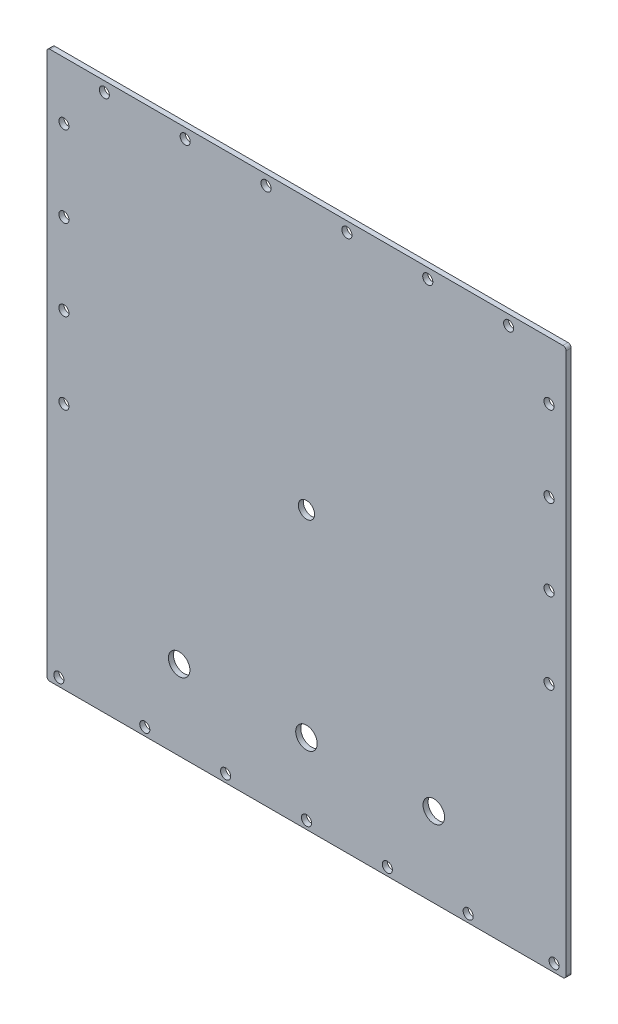
ISO-10303-21;
HEADER;
FILE_DESCRIPTION(('STEP AP214'),'2;1');
FILE_NAME('part.step','',(''),(''),'','','');
FILE_SCHEMA(('AUTOMOTIVE_DESIGN { 1 0 10303 214 1 1 1 1 }'));
ENDSEC;
DATA;
#1=APPLICATION_CONTEXT('core data for automotive mechanical design processes');
#2=APPLICATION_PROTOCOL_DEFINITION('international standard','automotive_design',2000,#1);
#3=PRODUCT_CONTEXT('',#1,'mechanical');
#4=PRODUCT('Part','Part','',(#3));
#5=PRODUCT_RELATED_PRODUCT_CATEGORY('part','',(#4));
#6=PRODUCT_DEFINITION_FORMATION('','',#4);
#7=PRODUCT_DEFINITION_CONTEXT('part definition',#1,'design');
#8=PRODUCT_DEFINITION('design','',#6,#7);
#9=PRODUCT_DEFINITION_SHAPE('','',#8);
#10=(LENGTH_UNIT() NAMED_UNIT(*) SI_UNIT(.MILLI.,.METRE.));
#11=(NAMED_UNIT(*) PLANE_ANGLE_UNIT() SI_UNIT($,.RADIAN.));
#12=(NAMED_UNIT(*) SI_UNIT($,.STERADIAN.) SOLID_ANGLE_UNIT());
#13=UNCERTAINTY_MEASURE_WITH_UNIT(LENGTH_MEASURE(1.E-05),#10,'distance_accuracy_value','');
#14=(GEOMETRIC_REPRESENTATION_CONTEXT(3) GLOBAL_UNCERTAINTY_ASSIGNED_CONTEXT((#13)) GLOBAL_UNIT_ASSIGNED_CONTEXT((#10,
#11,#12)) REPRESENTATION_CONTEXT('',''));
#15=CARTESIAN_POINT('',(0.,0.,0.));
#16=DIRECTION('',(0.,0.,1.));
#17=DIRECTION('',(1.,0.,0.));
#18=AXIS2_PLACEMENT_3D('',#15,#16,#17);
#19=CARTESIAN_POINT('',(0.,-171.98,1.5875));
#20=DIRECTION('',(0.,1.,0.));
#21=DIRECTION('',(-1.,0.,0.));
#22=AXIS2_PLACEMENT_3D('',#19,#20,#21);
#23=PLANE('',#22);
#24=DIRECTION('',(1.,0.,0.));
#25=VECTOR('',#24,1.);
#26=CARTESIAN_POINT('',(0.,-171.98,1.5875));
#27=LINE('',#26,#25);
#28=CARTESIAN_POINT('',(2.00000000000002,-171.98,1.5875));
#29=VERTEX_POINT('',#28);
#30=CARTESIAN_POINT('',(163.1,-171.98,1.5875));
#31=VERTEX_POINT('',#30);
#32=EDGE_CURVE('E132',#29,#31,#27,.T.);
#33=ORIENTED_EDGE('',*,*,#32,.F.);
#34=DIRECTION('',(0.,0.,-1.));
#35=VECTOR('',#34,1.);
#36=CARTESIAN_POINT('',(2.00000000000002,-171.98,1.5875));
#37=LINE('',#36,#35);
#38=CARTESIAN_POINT('',(2.00000000000002,-171.98,0.));
#39=VERTEX_POINT('',#38);
#40=EDGE_CURVE('E116',#29,#39,#37,.T.);
#41=ORIENTED_EDGE('',*,*,#40,.T.);
#42=DIRECTION('',(1.,0.,0.));
#43=VECTOR('',#42,1.);
#44=CARTESIAN_POINT('',(0.,-171.98,0.));
#45=LINE('',#44,#43);
#46=CARTESIAN_POINT('',(163.1,-171.98,0.));
#47=VERTEX_POINT('',#46);
#48=EDGE_CURVE('E129',#39,#47,#45,.T.);
#49=ORIENTED_EDGE('',*,*,#48,.T.);
#50=DIRECTION('',(0.,0.,-1.));
#51=VECTOR('',#50,1.);
#52=CARTESIAN_POINT('',(163.1,-171.98,1.5875));
#53=LINE('',#52,#51);
#54=EDGE_CURVE('E135',#47,#31,#53,.F.);
#55=ORIENTED_EDGE('',*,*,#54,.T.);
#56=EDGE_LOOP('',(#33,#41,#49,#55));
#57=FACE_BOUND('',#56,.T.);
#58=ADVANCED_FACE('F45',(#57),#23,.F.);
#59=CARTESIAN_POINT('',(164.1,0.,1.5875));
#60=DIRECTION('',(-1.,0.,0.));
#61=DIRECTION('',(0.,0.,1.));
#62=AXIS2_PLACEMENT_3D('',#59,#60,#61);
#63=PLANE('',#62);
#64=DIRECTION('',(0.,1.,0.));
#65=VECTOR('',#64,1.);
#66=CARTESIAN_POINT('',(164.1,0.,0.));
#67=LINE('',#66,#65);
#68=CARTESIAN_POINT('',(164.1,-170.98,0.));
#69=VERTEX_POINT('',#68);
#70=CARTESIAN_POINT('',(164.1,-0.99999999999998,0.));
#71=VERTEX_POINT('',#70);
#72=EDGE_CURVE('E141',#69,#71,#67,.T.);
#73=ORIENTED_EDGE('',*,*,#72,.T.);
#74=DIRECTION('',(0.,0.,-1.));
#75=VECTOR('',#74,1.);
#76=CARTESIAN_POINT('',(164.1,-0.99999999999998,1.5875));
#77=LINE('',#76,#75);
#78=CARTESIAN_POINT('',(164.1,-0.99999999999998,1.5875));
#79=VERTEX_POINT('',#78);
#80=EDGE_CURVE('E11',#71,#79,#77,.F.);
#81=ORIENTED_EDGE('',*,*,#80,.T.);
#82=DIRECTION('',(0.,1.,0.));
#83=VECTOR('',#82,1.);
#84=CARTESIAN_POINT('',(164.1,0.,1.5875));
#85=LINE('',#84,#83);
#86=CARTESIAN_POINT('',(164.1,-170.98,1.5875));
#87=VERTEX_POINT('',#86);
#88=EDGE_CURVE('E283',#87,#79,#85,.T.);
#89=ORIENTED_EDGE('',*,*,#88,.F.);
#90=DIRECTION('',(0.,0.,-1.));
#91=VECTOR('',#90,1.);
#92=CARTESIAN_POINT('',(164.1,-170.98,1.5875));
#93=LINE('',#92,#91);
#94=EDGE_CURVE('E54',#87,#69,#93,.T.);
#95=ORIENTED_EDGE('',*,*,#94,.T.);
#96=EDGE_LOOP('',(#73,#81,#89,#95));
#97=FACE_BOUND('',#96,.T.);
#98=ADVANCED_FACE('F281',(#97),#63,.F.);
#99=CARTESIAN_POINT('',(0.,0.,1.5875));
#100=DIRECTION('',(0.,1.,0.));
#101=DIRECTION('',(-1.,0.,0.));
#102=AXIS2_PLACEMENT_3D('',#99,#100,#101);
#103=PLANE('',#102);
#104=DIRECTION('',(1.,0.,0.));
#105=VECTOR('',#104,1.);
#106=CARTESIAN_POINT('',(0.,0.,0.));
#107=LINE('',#106,#105);
#108=CARTESIAN_POINT('',(2.,0.,0.));
#109=VERTEX_POINT('',#108);
#110=CARTESIAN_POINT('',(163.1,0.,0.));
#111=VERTEX_POINT('',#110);
#112=EDGE_CURVE('E147',#109,#111,#107,.T.);
#113=ORIENTED_EDGE('',*,*,#112,.F.);
#114=DIRECTION('',(0.,0.,-1.));
#115=VECTOR('',#114,1.);
#116=CARTESIAN_POINT('',(2.,0.,1.5875));
#117=LINE('',#116,#115);
#118=CARTESIAN_POINT('',(2.,0.,1.5875));
#119=VERTEX_POINT('',#118);
#120=EDGE_CURVE('E68',#109,#119,#117,.F.);
#121=ORIENTED_EDGE('',*,*,#120,.T.);
#122=DIRECTION('',(1.,0.,0.));
#123=VECTOR('',#122,1.);
#124=CARTESIAN_POINT('',(0.,0.,1.5875));
#125=LINE('',#124,#123);
#126=CARTESIAN_POINT('',(163.1,0.,1.5875));
#127=VERTEX_POINT('',#126);
#128=EDGE_CURVE('E290',#119,#127,#125,.T.);
#129=ORIENTED_EDGE('',*,*,#128,.T.);
#130=DIRECTION('',(0.,0.,-1.));
#131=VECTOR('',#130,1.);
#132=CARTESIAN_POINT('',(163.1,0.,0.));
#133=LINE('',#132,#131);
#134=EDGE_CURVE('E271',#127,#111,#133,.T.);
#135=ORIENTED_EDGE('',*,*,#134,.T.);
#136=EDGE_LOOP('',(#113,#121,#129,#135));
#137=FACE_BOUND('',#136,.T.);
#138=ADVANCED_FACE('F289',(#137),#103,.T.);
#139=CARTESIAN_POINT('',(158.75,-68.85,1.5875));
#140=DIRECTION('',(0.,0.,-1.));
#141=DIRECTION('',(-1.,0.,0.));
#142=AXIS2_PLACEMENT_3D('',#139,#140,#141);
#143=CYLINDRICAL_SURFACE('',#142,1.58749999999999);
#144=CARTESIAN_POINT('',(158.75,-68.85,1.5875));
#145=DIRECTION('',(0.,0.,1.));
#146=DIRECTION('',(1.,0.,0.));
#147=AXIS2_PLACEMENT_3D('',#144,#145,#146);
#148=CIRCLE('',#147,1.58749999999999);
#149=CARTESIAN_POINT('',(160.3375,-68.85,1.5875));
#150=VERTEX_POINT('',#149);
#151=EDGE_CURVE('E378',#150,#150,#148,.F.);
#152=ORIENTED_EDGE('',*,*,#151,.F.);
#153=EDGE_LOOP('',(#152));
#154=FACE_BOUND('',#153,.T.);
#155=CARTESIAN_POINT('',(158.75,-68.85,0.));
#156=DIRECTION('',(0.,0.,1.));
#157=DIRECTION('',(1.,0.,0.));
#158=AXIS2_PLACEMENT_3D('',#155,#156,#157);
#159=CIRCLE('',#158,1.58749999999999);
#160=CARTESIAN_POINT('',(160.3375,-68.85,0.));
#161=VERTEX_POINT('',#160);
#162=EDGE_CURVE('E236',#161,#161,#159,.F.);
#163=ORIENTED_EDGE('',*,*,#162,.T.);
#164=EDGE_LOOP('',(#163));
#165=FACE_BOUND('',#164,.T.);
#166=ADVANCED_FACE('F551',(#154,#165),#143,.F.);
#167=CARTESIAN_POINT('',(120.65,-3.17499999999999,1.5875));
#168=DIRECTION('',(0.,0.,-1.));
#169=DIRECTION('',(-1.,0.,0.));
#170=AXIS2_PLACEMENT_3D('',#167,#168,#169);
#171=CYLINDRICAL_SURFACE('',#170,1.5875);
#172=CARTESIAN_POINT('',(120.65,-3.17499999999999,1.5875));
#173=DIRECTION('',(0.,0.,1.));
#174=DIRECTION('',(1.,0.,0.));
#175=AXIS2_PLACEMENT_3D('',#172,#173,#174);
#176=CIRCLE('',#175,1.5875);
#177=CARTESIAN_POINT('',(122.2375,-3.17499999999999,1.5875));
#178=VERTEX_POINT('',#177);
#179=EDGE_CURVE('E374',#178,#178,#176,.F.);
#180=ORIENTED_EDGE('',*,*,#179,.F.);
#181=EDGE_LOOP('',(#180));
#182=FACE_BOUND('',#181,.T.);
#183=CARTESIAN_POINT('',(120.65,-3.17499999999999,0.));
#184=DIRECTION('',(0.,0.,1.));
#185=DIRECTION('',(1.,0.,0.));
#186=AXIS2_PLACEMENT_3D('',#183,#184,#185);
#187=CIRCLE('',#186,1.5875);
#188=CARTESIAN_POINT('',(122.2375,-3.17499999999999,0.));
#189=VERTEX_POINT('',#188);
#190=EDGE_CURVE('E232',#189,#189,#187,.F.);
#191=ORIENTED_EDGE('',*,*,#190,.T.);
#192=EDGE_LOOP('',(#191));
#193=FACE_BOUND('',#192,.T.);
#194=ADVANCED_FACE('F772',(#182,#193),#171,.F.);
#195=CARTESIAN_POINT('',(160.3375,-169.48,1.5875));
#196=DIRECTION('',(0.,0.,-1.));
#197=DIRECTION('',(-1.,0.,0.));
#198=AXIS2_PLACEMENT_3D('',#195,#196,#197);
#199=CYLINDRICAL_SURFACE('',#198,1.58749999999999);
#200=CARTESIAN_POINT('',(160.3375,-169.48,1.5875));
#201=DIRECTION('',(0.,0.,1.));
#202=DIRECTION('',(1.,0.,0.));
#203=AXIS2_PLACEMENT_3D('',#200,#201,#202);
#204=CIRCLE('',#203,1.58749999999999);
#205=CARTESIAN_POINT('',(161.925,-169.48,1.5875));
#206=VERTEX_POINT('',#205);
#207=EDGE_CURVE('E370',#206,#206,#204,.T.);
#208=ORIENTED_EDGE('',*,*,#207,.T.);
#209=EDGE_LOOP('',(#208));
#210=FACE_BOUND('',#209,.T.);
#211=CARTESIAN_POINT('',(160.3375,-169.48,0.));
#212=DIRECTION('',(0.,0.,1.));
#213=DIRECTION('',(1.,0.,0.));
#214=AXIS2_PLACEMENT_3D('',#211,#212,#213);
#215=CIRCLE('',#214,1.58749999999999);
#216=CARTESIAN_POINT('',(161.925,-169.48,0.));
#217=VERTEX_POINT('',#216);
#218=EDGE_CURVE('E228',#217,#217,#215,.T.);
#219=ORIENTED_EDGE('',*,*,#218,.F.);
#220=EDGE_LOOP('',(#219));
#221=FACE_BOUND('',#220,.T.);
#222=ADVANCED_FACE('F761',(#210,#221),#199,.F.);
#223=CARTESIAN_POINT('',(133.35,-169.48,1.5875));
#224=DIRECTION('',(0.,0.,-1.));
#225=DIRECTION('',(-1.,0.,0.));
#226=AXIS2_PLACEMENT_3D('',#223,#224,#225);
#227=CYLINDRICAL_SURFACE('',#226,1.58749999999999);
#228=CARTESIAN_POINT('',(133.35,-169.48,1.5875));
#229=DIRECTION('',(0.,0.,1.));
#230=DIRECTION('',(1.,0.,0.));
#231=AXIS2_PLACEMENT_3D('',#228,#229,#230);
#232=CIRCLE('',#231,1.58749999999999);
#233=CARTESIAN_POINT('',(134.9375,-169.48,1.5875));
#234=VERTEX_POINT('',#233);
#235=EDGE_CURVE('E366',#234,#234,#232,.T.);
#236=ORIENTED_EDGE('',*,*,#235,.T.);
#237=EDGE_LOOP('',(#236));
#238=FACE_BOUND('',#237,.T.);
#239=CARTESIAN_POINT('',(133.35,-169.48,0.));
#240=DIRECTION('',(0.,0.,1.));
#241=DIRECTION('',(1.,0.,0.));
#242=AXIS2_PLACEMENT_3D('',#239,#240,#241);
#243=CIRCLE('',#242,1.58749999999999);
#244=CARTESIAN_POINT('',(134.9375,-169.48,0.));
#245=VERTEX_POINT('',#244);
#246=EDGE_CURVE('E224',#245,#245,#243,.T.);
#247=ORIENTED_EDGE('',*,*,#246,.F.);
#248=EDGE_LOOP('',(#247));
#249=FACE_BOUND('',#248,.T.);
#250=ADVANCED_FACE('F750',(#238,#249),#227,.F.);
#251=CARTESIAN_POINT('',(107.95,-169.48,1.5875));
#252=DIRECTION('',(0.,0.,-1.));
#253=DIRECTION('',(-1.,0.,0.));
#254=AXIS2_PLACEMENT_3D('',#251,#252,#253);
#255=CYLINDRICAL_SURFACE('',#254,1.58749999999999);
#256=CARTESIAN_POINT('',(107.95,-169.48,1.5875));
#257=DIRECTION('',(0.,0.,1.));
#258=DIRECTION('',(1.,0.,0.));
#259=AXIS2_PLACEMENT_3D('',#256,#257,#258);
#260=CIRCLE('',#259,1.58749999999999);
#261=CARTESIAN_POINT('',(109.5375,-169.48,1.5875));
#262=VERTEX_POINT('',#261);
#263=EDGE_CURVE('E362',#262,#262,#260,.T.);
#264=ORIENTED_EDGE('',*,*,#263,.T.);
#265=EDGE_LOOP('',(#264));
#266=FACE_BOUND('',#265,.T.);
#267=CARTESIAN_POINT('',(107.95,-169.48,0.));
#268=DIRECTION('',(0.,0.,1.));
#269=DIRECTION('',(1.,0.,0.));
#270=AXIS2_PLACEMENT_3D('',#267,#268,#269);
#271=CIRCLE('',#270,1.58749999999999);
#272=CARTESIAN_POINT('',(109.5375,-169.48,0.));
#273=VERTEX_POINT('',#272);
#274=EDGE_CURVE('E220',#273,#273,#271,.T.);
#275=ORIENTED_EDGE('',*,*,#274,.F.);
#276=EDGE_LOOP('',(#275));
#277=FACE_BOUND('',#276,.T.);
#278=ADVANCED_FACE('F739',(#266,#277),#255,.F.);
#279=CARTESIAN_POINT('',(95.25,-3.175,1.5875));
#280=DIRECTION('',(0.,0.,-1.));
#281=DIRECTION('',(-1.,0.,0.));
#282=AXIS2_PLACEMENT_3D('',#279,#280,#281);
#283=CYLINDRICAL_SURFACE('',#282,1.5875);
#284=CARTESIAN_POINT('',(95.25,-3.175,1.5875));
#285=DIRECTION('',(0.,0.,1.));
#286=DIRECTION('',(1.,0.,0.));
#287=AXIS2_PLACEMENT_3D('',#284,#285,#286);
#288=CIRCLE('',#287,1.5875);
#289=CARTESIAN_POINT('',(96.8375,-3.175,1.5875));
#290=VERTEX_POINT('',#289);
#291=EDGE_CURVE('E358',#290,#290,#288,.F.);
#292=ORIENTED_EDGE('',*,*,#291,.F.);
#293=EDGE_LOOP('',(#292));
#294=FACE_BOUND('',#293,.T.);
#295=CARTESIAN_POINT('',(95.25,-3.175,0.));
#296=DIRECTION('',(0.,0.,1.));
#297=DIRECTION('',(1.,0.,0.));
#298=AXIS2_PLACEMENT_3D('',#295,#296,#297);
#299=CIRCLE('',#298,1.5875);
#300=CARTESIAN_POINT('',(96.8375,-3.175,0.));
#301=VERTEX_POINT('',#300);
#302=EDGE_CURVE('E216',#301,#301,#299,.F.);
#303=ORIENTED_EDGE('',*,*,#302,.T.);
#304=EDGE_LOOP('',(#303));
#305=FACE_BOUND('',#304,.T.);
#306=ADVANCED_FACE('F728',(#294,#305),#283,.F.);
#307=CARTESIAN_POINT('',(146.05,-3.17499999999998,1.5875));
#308=DIRECTION('',(0.,0.,-1.));
#309=DIRECTION('',(-1.,0.,0.));
#310=AXIS2_PLACEMENT_3D('',#307,#308,#309);
#311=CYLINDRICAL_SURFACE('',#310,1.58749999999999);
#312=CARTESIAN_POINT('',(146.05,-3.17499999999998,1.5875));
#313=DIRECTION('',(0.,0.,1.));
#314=DIRECTION('',(1.,0.,0.));
#315=AXIS2_PLACEMENT_3D('',#312,#313,#314);
#316=CIRCLE('',#315,1.58749999999999);
#317=CARTESIAN_POINT('',(147.6375,-3.17499999999998,1.5875));
#318=VERTEX_POINT('',#317);
#319=EDGE_CURVE('E354',#318,#318,#316,.F.);
#320=ORIENTED_EDGE('',*,*,#319,.F.);
#321=EDGE_LOOP('',(#320));
#322=FACE_BOUND('',#321,.T.);
#323=CARTESIAN_POINT('',(146.05,-3.17499999999998,0.));
#324=DIRECTION('',(0.,0.,1.));
#325=DIRECTION('',(1.,0.,0.));
#326=AXIS2_PLACEMENT_3D('',#323,#324,#325);
#327=CIRCLE('',#326,1.58749999999999);
#328=CARTESIAN_POINT('',(147.6375,-3.17499999999998,0.));
#329=VERTEX_POINT('',#328);
#330=EDGE_CURVE('E212',#329,#329,#327,.F.);
#331=ORIENTED_EDGE('',*,*,#330,.T.);
#332=EDGE_LOOP('',(#331));
#333=FACE_BOUND('',#332,.T.);
#334=ADVANCED_FACE('F717',(#322,#333),#311,.F.);
#335=CARTESIAN_POINT('',(158.75,-94.25,1.5875));
#336=DIRECTION('',(0.,0.,-1.));
#337=DIRECTION('',(-1.,0.,0.));
#338=AXIS2_PLACEMENT_3D('',#335,#336,#337);
#339=CYLINDRICAL_SURFACE('',#338,1.58749999999999);
#340=CARTESIAN_POINT('',(158.75,-94.25,1.5875));
#341=DIRECTION('',(0.,0.,1.));
#342=DIRECTION('',(1.,0.,0.));
#343=AXIS2_PLACEMENT_3D('',#340,#341,#342);
#344=CIRCLE('',#343,1.58749999999999);
#345=CARTESIAN_POINT('',(160.3375,-94.25,1.5875));
#346=VERTEX_POINT('',#345);
#347=EDGE_CURVE('E350',#346,#346,#344,.F.);
#348=ORIENTED_EDGE('',*,*,#347,.F.);
#349=EDGE_LOOP('',(#348));
#350=FACE_BOUND('',#349,.T.);
#351=CARTESIAN_POINT('',(158.75,-94.25,0.));
#352=DIRECTION('',(0.,0.,1.));
#353=DIRECTION('',(1.,0.,0.));
#354=AXIS2_PLACEMENT_3D('',#351,#352,#353);
#355=CIRCLE('',#354,1.58749999999999);
#356=CARTESIAN_POINT('',(160.3375,-94.25,0.));
#357=VERTEX_POINT('',#356);
#358=EDGE_CURVE('E208',#357,#357,#355,.F.);
#359=ORIENTED_EDGE('',*,*,#358,.T.);
#360=EDGE_LOOP('',(#359));
#361=FACE_BOUND('',#360,.T.);
#362=ADVANCED_FACE('F706',(#350,#361),#339,.F.);
#363=CARTESIAN_POINT('',(158.750000000001,-18.05,1.5875));
#364=DIRECTION('',(0.,0.,-1.));
#365=DIRECTION('',(-1.,0.,0.));
#366=AXIS2_PLACEMENT_3D('',#363,#364,#365);
#367=CYLINDRICAL_SURFACE('',#366,1.58749999999999);
#368=CARTESIAN_POINT('',(158.750000000001,-18.05,1.5875));
#369=DIRECTION('',(0.,0.,1.));
#370=DIRECTION('',(1.,0.,0.));
#371=AXIS2_PLACEMENT_3D('',#368,#369,#370);
#372=CIRCLE('',#371,1.58749999999999);
#373=CARTESIAN_POINT('',(160.3375,-18.05,1.5875));
#374=VERTEX_POINT('',#373);
#375=EDGE_CURVE('E346',#374,#374,#372,.F.);
#376=ORIENTED_EDGE('',*,*,#375,.F.);
#377=EDGE_LOOP('',(#376));
#378=FACE_BOUND('',#377,.T.);
#379=CARTESIAN_POINT('',(158.750000000001,-18.05,0.));
#380=DIRECTION('',(0.,0.,1.));
#381=DIRECTION('',(1.,0.,0.));
#382=AXIS2_PLACEMENT_3D('',#379,#380,#381);
#383=CIRCLE('',#382,1.58749999999999);
#384=CARTESIAN_POINT('',(160.3375,-18.05,0.));
#385=VERTEX_POINT('',#384);
#386=EDGE_CURVE('E204',#385,#385,#383,.F.);
#387=ORIENTED_EDGE('',*,*,#386,.T.);
#388=EDGE_LOOP('',(#387));
#389=FACE_BOUND('',#388,.T.);
#390=ADVANCED_FACE('F695',(#378,#389),#367,.F.);
#391=CARTESIAN_POINT('',(69.85,-3.175,1.5875));
#392=DIRECTION('',(0.,0.,-1.));
#393=DIRECTION('',(-1.,0.,0.));
#394=AXIS2_PLACEMENT_3D('',#391,#392,#393);
#395=CYLINDRICAL_SURFACE('',#394,1.5875);
#396=CARTESIAN_POINT('',(69.85,-3.175,1.5875));
#397=DIRECTION('',(0.,0.,1.));
#398=DIRECTION('',(1.,0.,0.));
#399=AXIS2_PLACEMENT_3D('',#396,#397,#398);
#400=CIRCLE('',#399,1.5875);
#401=CARTESIAN_POINT('',(71.4375,-3.175,1.5875));
#402=VERTEX_POINT('',#401);
#403=EDGE_CURVE('E342',#402,#402,#400,.T.);
#404=ORIENTED_EDGE('',*,*,#403,.T.);
#405=EDGE_LOOP('',(#404));
#406=FACE_BOUND('',#405,.T.);
#407=CARTESIAN_POINT('',(69.85,-3.175,0.));
#408=DIRECTION('',(0.,0.,1.));
#409=DIRECTION('',(1.,0.,0.));
#410=AXIS2_PLACEMENT_3D('',#407,#408,#409);
#411=CIRCLE('',#410,1.5875);
#412=CARTESIAN_POINT('',(71.4375,-3.175,0.));
#413=VERTEX_POINT('',#412);
#414=EDGE_CURVE('E200',#413,#413,#411,.T.);
#415=ORIENTED_EDGE('',*,*,#414,.F.);
#416=EDGE_LOOP('',(#415));
#417=FACE_BOUND('',#416,.T.);
#418=ADVANCED_FACE('F684',(#406,#417),#395,.F.);
#419=CARTESIAN_POINT('',(44.45,-3.175,1.5875));
#420=DIRECTION('',(0.,0.,-1.));
#421=DIRECTION('',(-1.,0.,0.));
#422=AXIS2_PLACEMENT_3D('',#419,#420,#421);
#423=CYLINDRICAL_SURFACE('',#422,1.5875);
#424=CARTESIAN_POINT('',(44.45,-3.175,1.5875));
#425=DIRECTION('',(0.,0.,1.));
#426=DIRECTION('',(1.,0.,0.));
#427=AXIS2_PLACEMENT_3D('',#424,#425,#426);
#428=CIRCLE('',#427,1.5875);
#429=CARTESIAN_POINT('',(46.0375,-3.175,1.5875));
#430=VERTEX_POINT('',#429);
#431=EDGE_CURVE('E338',#430,#430,#428,.T.);
#432=ORIENTED_EDGE('',*,*,#431,.T.);
#433=EDGE_LOOP('',(#432));
#434=FACE_BOUND('',#433,.T.);
#435=CARTESIAN_POINT('',(44.45,-3.175,0.));
#436=DIRECTION('',(0.,0.,1.));
#437=DIRECTION('',(1.,0.,0.));
#438=AXIS2_PLACEMENT_3D('',#435,#436,#437);
#439=CIRCLE('',#438,1.5875);
#440=CARTESIAN_POINT('',(46.0375,-3.175,0.));
#441=VERTEX_POINT('',#440);
#442=EDGE_CURVE('E196',#441,#441,#439,.T.);
#443=ORIENTED_EDGE('',*,*,#442,.F.);
#444=EDGE_LOOP('',(#443));
#445=FACE_BOUND('',#444,.T.);
#446=ADVANCED_FACE('F673',(#434,#445),#423,.F.);
#447=CARTESIAN_POINT('',(19.05,-3.175,1.5875));
#448=DIRECTION('',(0.,0.,-1.));
#449=DIRECTION('',(-1.,0.,0.));
#450=AXIS2_PLACEMENT_3D('',#447,#448,#449);
#451=CYLINDRICAL_SURFACE('',#450,1.5875);
#452=CARTESIAN_POINT('',(19.05,-3.175,1.5875));
#453=DIRECTION('',(0.,0.,1.));
#454=DIRECTION('',(1.,0.,0.));
#455=AXIS2_PLACEMENT_3D('',#452,#453,#454);
#456=CIRCLE('',#455,1.5875);
#457=CARTESIAN_POINT('',(20.6375,-3.175,1.5875));
#458=VERTEX_POINT('',#457);
#459=EDGE_CURVE('E334',#458,#458,#456,.T.);
#460=ORIENTED_EDGE('',*,*,#459,.T.);
#461=EDGE_LOOP('',(#460));
#462=FACE_BOUND('',#461,.T.);
#463=CARTESIAN_POINT('',(19.05,-3.175,0.));
#464=DIRECTION('',(0.,0.,1.));
#465=DIRECTION('',(1.,0.,0.));
#466=AXIS2_PLACEMENT_3D('',#463,#464,#465);
#467=CIRCLE('',#466,1.5875);
#468=CARTESIAN_POINT('',(20.6375,-3.175,0.));
#469=VERTEX_POINT('',#468);
#470=EDGE_CURVE('E192',#469,#469,#467,.T.);
#471=ORIENTED_EDGE('',*,*,#470,.F.);
#472=EDGE_LOOP('',(#471));
#473=FACE_BOUND('',#472,.T.);
#474=ADVANCED_FACE('F662',(#462,#473),#451,.F.);
#475=CARTESIAN_POINT('',(31.75,-169.48,1.5875));
#476=DIRECTION('',(0.,0.,-1.));
#477=DIRECTION('',(-1.,0.,0.));
#478=AXIS2_PLACEMENT_3D('',#475,#476,#477);
#479=CYLINDRICAL_SURFACE('',#478,1.5875);
#480=CARTESIAN_POINT('',(31.75,-169.48,1.5875));
#481=DIRECTION('',(0.,0.,1.));
#482=DIRECTION('',(1.,0.,0.));
#483=AXIS2_PLACEMENT_3D('',#480,#481,#482);
#484=CIRCLE('',#483,1.5875);
#485=CARTESIAN_POINT('',(33.3375,-169.48,1.5875));
#486=VERTEX_POINT('',#485);
#487=EDGE_CURVE('E330',#486,#486,#484,.T.);
#488=ORIENTED_EDGE('',*,*,#487,.T.);
#489=EDGE_LOOP('',(#488));
#490=FACE_BOUND('',#489,.T.);
#491=CARTESIAN_POINT('',(31.75,-169.48,0.));
#492=DIRECTION('',(0.,0.,1.));
#493=DIRECTION('',(1.,0.,0.));
#494=AXIS2_PLACEMENT_3D('',#491,#492,#493);
#495=CIRCLE('',#494,1.5875);
#496=CARTESIAN_POINT('',(33.3375,-169.48,0.));
#497=VERTEX_POINT('',#496);
#498=EDGE_CURVE('E188',#497,#497,#495,.T.);
#499=ORIENTED_EDGE('',*,*,#498,.F.);
#500=EDGE_LOOP('',(#499));
#501=FACE_BOUND('',#500,.T.);
#502=ADVANCED_FACE('F651',(#490,#501),#479,.F.);
#503=CARTESIAN_POINT('',(57.15,-169.48,1.5875));
#504=DIRECTION('',(0.,0.,-1.));
#505=DIRECTION('',(-1.,0.,0.));
#506=AXIS2_PLACEMENT_3D('',#503,#504,#505);
#507=CYLINDRICAL_SURFACE('',#506,1.5875);
#508=CARTESIAN_POINT('',(57.15,-169.48,1.5875));
#509=DIRECTION('',(0.,0.,1.));
#510=DIRECTION('',(1.,0.,0.));
#511=AXIS2_PLACEMENT_3D('',#508,#509,#510);
#512=CIRCLE('',#511,1.5875);
#513=CARTESIAN_POINT('',(58.7375,-169.48,1.5875));
#514=VERTEX_POINT('',#513);
#515=EDGE_CURVE('E326',#514,#514,#512,.T.);
#516=ORIENTED_EDGE('',*,*,#515,.T.);
#517=EDGE_LOOP('',(#516));
#518=FACE_BOUND('',#517,.T.);
#519=CARTESIAN_POINT('',(57.15,-169.48,0.));
#520=DIRECTION('',(0.,0.,1.));
#521=DIRECTION('',(1.,0.,0.));
#522=AXIS2_PLACEMENT_3D('',#519,#520,#521);
#523=CIRCLE('',#522,1.5875);
#524=CARTESIAN_POINT('',(58.7375,-169.48,0.));
#525=VERTEX_POINT('',#524);
#526=EDGE_CURVE('E184',#525,#525,#523,.T.);
#527=ORIENTED_EDGE('',*,*,#526,.F.);
#528=EDGE_LOOP('',(#527));
#529=FACE_BOUND('',#528,.T.);
#530=ADVANCED_FACE('F640',(#518,#529),#507,.F.);
#531=CARTESIAN_POINT('',(6.34999999999949,-18.05,1.5875));
#532=DIRECTION('',(0.,0.,-1.));
#533=DIRECTION('',(-1.,0.,0.));
#534=AXIS2_PLACEMENT_3D('',#531,#532,#533);
#535=CYLINDRICAL_SURFACE('',#534,1.5875);
#536=CARTESIAN_POINT('',(6.34999999999949,-18.05,1.5875));
#537=DIRECTION('',(0.,0.,1.));
#538=DIRECTION('',(1.,0.,0.));
#539=AXIS2_PLACEMENT_3D('',#536,#537,#538);
#540=CIRCLE('',#539,1.5875);
#541=CARTESIAN_POINT('',(7.93749999999949,-18.05,1.5875));
#542=VERTEX_POINT('',#541);
#543=EDGE_CURVE('E322',#542,#542,#540,.T.);
#544=ORIENTED_EDGE('',*,*,#543,.T.);
#545=EDGE_LOOP('',(#544));
#546=FACE_BOUND('',#545,.T.);
#547=CARTESIAN_POINT('',(6.34999999999949,-18.05,0.));
#548=DIRECTION('',(0.,0.,1.));
#549=DIRECTION('',(1.,0.,0.));
#550=AXIS2_PLACEMENT_3D('',#547,#548,#549);
#551=CIRCLE('',#550,1.5875);
#552=CARTESIAN_POINT('',(7.93749999999949,-18.05,0.));
#553=VERTEX_POINT('',#552);
#554=EDGE_CURVE('E180',#553,#553,#551,.T.);
#555=ORIENTED_EDGE('',*,*,#554,.F.);
#556=EDGE_LOOP('',(#555));
#557=FACE_BOUND('',#556,.T.);
#558=ADVANCED_FACE('F629',(#546,#557),#535,.F.);
#559=CARTESIAN_POINT('',(4.7625,-169.48,1.5875));
#560=DIRECTION('',(0.,0.,-1.));
#561=DIRECTION('',(-1.,0.,0.));
#562=AXIS2_PLACEMENT_3D('',#559,#560,#561);
#563=CYLINDRICAL_SURFACE('',#562,1.5875);
#564=CARTESIAN_POINT('',(4.7625,-169.48,1.5875));
#565=DIRECTION('',(0.,0.,1.));
#566=DIRECTION('',(1.,0.,0.));
#567=AXIS2_PLACEMENT_3D('',#564,#565,#566);
#568=CIRCLE('',#567,1.5875);
#569=CARTESIAN_POINT('',(6.35,-169.48,1.5875));
#570=VERTEX_POINT('',#569);
#571=EDGE_CURVE('E318',#570,#570,#568,.F.);
#572=ORIENTED_EDGE('',*,*,#571,.F.);
#573=EDGE_LOOP('',(#572));
#574=FACE_BOUND('',#573,.T.);
#575=CARTESIAN_POINT('',(4.7625,-169.48,0.));
#576=DIRECTION('',(0.,0.,1.));
#577=DIRECTION('',(1.,0.,0.));
#578=AXIS2_PLACEMENT_3D('',#575,#576,#577);
#579=CIRCLE('',#578,1.5875);
#580=CARTESIAN_POINT('',(6.35,-169.48,0.));
#581=VERTEX_POINT('',#580);
#582=EDGE_CURVE('E176',#581,#581,#579,.F.);
#583=ORIENTED_EDGE('',*,*,#582,.T.);
#584=EDGE_LOOP('',(#583));
#585=FACE_BOUND('',#584,.T.);
#586=ADVANCED_FACE('F618',(#574,#585),#563,.F.);
#587=CARTESIAN_POINT('',(6.34999999999976,-43.45,1.5875));
#588=DIRECTION('',(0.,0.,-1.));
#589=DIRECTION('',(-1.,0.,0.));
#590=AXIS2_PLACEMENT_3D('',#587,#588,#589);
#591=CYLINDRICAL_SURFACE('',#590,1.5875);
#592=CARTESIAN_POINT('',(6.34999999999976,-43.45,1.5875));
#593=DIRECTION('',(0.,0.,1.));
#594=DIRECTION('',(1.,0.,0.));
#595=AXIS2_PLACEMENT_3D('',#592,#593,#594);
#596=CIRCLE('',#595,1.5875);
#597=CARTESIAN_POINT('',(7.93749999999976,-43.45,1.5875));
#598=VERTEX_POINT('',#597);
#599=EDGE_CURVE('E314',#598,#598,#596,.T.);
#600=ORIENTED_EDGE('',*,*,#599,.T.);
#601=EDGE_LOOP('',(#600));
#602=FACE_BOUND('',#601,.T.);
#603=CARTESIAN_POINT('',(6.34999999999976,-43.45,0.));
#604=DIRECTION('',(0.,0.,1.));
#605=DIRECTION('',(1.,0.,0.));
#606=AXIS2_PLACEMENT_3D('',#603,#604,#605);
#607=CIRCLE('',#606,1.5875);
#608=CARTESIAN_POINT('',(7.93749999999976,-43.45,0.));
#609=VERTEX_POINT('',#608);
#610=EDGE_CURVE('E172',#609,#609,#607,.T.);
#611=ORIENTED_EDGE('',*,*,#610,.F.);
#612=EDGE_LOOP('',(#611));
#613=FACE_BOUND('',#612,.T.);
#614=ADVANCED_FACE('F607',(#602,#613),#591,.F.);
#615=CARTESIAN_POINT('',(6.35000000000002,-68.85,1.5875));
#616=DIRECTION('',(0.,0.,-1.));
#617=DIRECTION('',(-1.,0.,0.));
#618=AXIS2_PLACEMENT_3D('',#615,#616,#617);
#619=CYLINDRICAL_SURFACE('',#618,1.5875);
#620=CARTESIAN_POINT('',(6.35000000000002,-68.85,1.5875));
#621=DIRECTION('',(0.,0.,1.));
#622=DIRECTION('',(1.,0.,0.));
#623=AXIS2_PLACEMENT_3D('',#620,#621,#622);
#624=CIRCLE('',#623,1.5875);
#625=CARTESIAN_POINT('',(7.93750000000002,-68.85,1.5875));
#626=VERTEX_POINT('',#625);
#627=EDGE_CURVE('E310',#626,#626,#624,.T.);
#628=ORIENTED_EDGE('',*,*,#627,.T.);
#629=EDGE_LOOP('',(#628));
#630=FACE_BOUND('',#629,.T.);
#631=CARTESIAN_POINT('',(6.35000000000002,-68.85,0.));
#632=DIRECTION('',(0.,0.,1.));
#633=DIRECTION('',(1.,0.,0.));
#634=AXIS2_PLACEMENT_3D('',#631,#632,#633);
#635=CIRCLE('',#634,1.5875);
#636=CARTESIAN_POINT('',(7.93750000000002,-68.85,0.));
#637=VERTEX_POINT('',#636);
#638=EDGE_CURVE('E168',#637,#637,#635,.T.);
#639=ORIENTED_EDGE('',*,*,#638,.F.);
#640=EDGE_LOOP('',(#639));
#641=FACE_BOUND('',#640,.T.);
#642=ADVANCED_FACE('F596',(#630,#641),#619,.F.);
#643=CARTESIAN_POINT('',(6.35000000000029,-94.25,1.5875));
#644=DIRECTION('',(0.,0.,-1.));
#645=DIRECTION('',(-1.,0.,0.));
#646=AXIS2_PLACEMENT_3D('',#643,#644,#645);
#647=CYLINDRICAL_SURFACE('',#646,1.5875);
#648=CARTESIAN_POINT('',(6.35000000000029,-94.25,1.5875));
#649=DIRECTION('',(0.,0.,1.));
#650=DIRECTION('',(1.,0.,0.));
#651=AXIS2_PLACEMENT_3D('',#648,#649,#650);
#652=CIRCLE('',#651,1.5875);
#653=CARTESIAN_POINT('',(7.93750000000029,-94.25,1.5875));
#654=VERTEX_POINT('',#653);
#655=EDGE_CURVE('E306',#654,#654,#652,.T.);
#656=ORIENTED_EDGE('',*,*,#655,.T.);
#657=EDGE_LOOP('',(#656));
#658=FACE_BOUND('',#657,.T.);
#659=CARTESIAN_POINT('',(6.35000000000029,-94.25,0.));
#660=DIRECTION('',(0.,0.,1.));
#661=DIRECTION('',(1.,0.,0.));
#662=AXIS2_PLACEMENT_3D('',#659,#660,#661);
#663=CIRCLE('',#662,1.5875);
#664=CARTESIAN_POINT('',(7.93750000000029,-94.25,0.));
#665=VERTEX_POINT('',#664);
#666=EDGE_CURVE('E164',#665,#665,#663,.T.);
#667=ORIENTED_EDGE('',*,*,#666,.F.);
#668=EDGE_LOOP('',(#667));
#669=FACE_BOUND('',#668,.T.);
#670=ADVANCED_FACE('F585',(#658,#669),#647,.F.);
#671=CARTESIAN_POINT('',(82.55,-169.48,1.5875));
#672=DIRECTION('',(0.,0.,-1.));
#673=DIRECTION('',(-1.,0.,0.));
#674=AXIS2_PLACEMENT_3D('',#671,#672,#673);
#675=CYLINDRICAL_SURFACE('',#674,1.5875);
#676=CARTESIAN_POINT('',(82.55,-169.48,1.5875));
#677=DIRECTION('',(0.,0.,1.));
#678=DIRECTION('',(1.,0.,0.));
#679=AXIS2_PLACEMENT_3D('',#676,#677,#678);
#680=CIRCLE('',#679,1.5875);
#681=CARTESIAN_POINT('',(84.1375,-169.48,1.5875));
#682=VERTEX_POINT('',#681);
#683=EDGE_CURVE('E298',#682,#682,#680,.T.);
#684=ORIENTED_EDGE('',*,*,#683,.T.);
#685=EDGE_LOOP('',(#684));
#686=FACE_BOUND('',#685,.T.);
#687=CARTESIAN_POINT('',(82.55,-169.48,0.));
#688=DIRECTION('',(0.,0.,1.));
#689=DIRECTION('',(1.,0.,0.));
#690=AXIS2_PLACEMENT_3D('',#687,#688,#689);
#691=CIRCLE('',#690,1.5875);
#692=CARTESIAN_POINT('',(84.1375,-169.48,0.));
#693=VERTEX_POINT('',#692);
#694=EDGE_CURVE('E160',#693,#693,#691,.T.);
#695=ORIENTED_EDGE('',*,*,#694,.F.);
#696=EDGE_LOOP('',(#695));
#697=FACE_BOUND('',#696,.T.);
#698=ADVANCED_FACE('F537',(#686,#697),#675,.F.);
#699=CARTESIAN_POINT('',(1.,0.,1.5875));
#700=DIRECTION('',(1.,0.,0.));
#701=DIRECTION('',(0.,1.,0.));
#702=AXIS2_PLACEMENT_3D('',#699,#700,#701);
#703=PLANE('',#702);
#704=DIRECTION('',(0.,-1.,0.));
#705=VECTOR('',#704,1.);
#706=CARTESIAN_POINT('',(1.,0.,0.));
#707=LINE('',#706,#705);
#708=CARTESIAN_POINT('',(1.,-1.,0.));
#709=VERTEX_POINT('',#708);
#710=CARTESIAN_POINT('',(1.00000000000002,-170.98,0.));
#711=VERTEX_POINT('',#710);
#712=EDGE_CURVE('E157',#709,#711,#707,.T.);
#713=ORIENTED_EDGE('',*,*,#712,.T.);
#714=DIRECTION('',(0.,0.,-1.));
#715=VECTOR('',#714,1.);
#716=CARTESIAN_POINT('',(1.00000000000002,-170.98,1.5875));
#717=LINE('',#716,#715);
#718=CARTESIAN_POINT('',(1.00000000000002,-170.98,1.5875));
#719=VERTEX_POINT('',#718);
#720=EDGE_CURVE('E117',#711,#719,#717,.F.);
#721=ORIENTED_EDGE('',*,*,#720,.T.);
#722=DIRECTION('',(0.,-1.,0.));
#723=VECTOR('',#722,1.);
#724=CARTESIAN_POINT('',(1.,0.,1.5875));
#725=LINE('',#724,#723);
#726=CARTESIAN_POINT('',(1.,-1.,1.5875));
#727=VERTEX_POINT('',#726);
#728=EDGE_CURVE('E293',#727,#719,#725,.T.);
#729=ORIENTED_EDGE('',*,*,#728,.F.);
#730=DIRECTION('',(0.,0.,-1.));
#731=VECTOR('',#730,1.);
#732=CARTESIAN_POINT('',(1.,-1.,0.));
#733=LINE('',#732,#731);
#734=EDGE_CURVE('E123',#727,#709,#733,.T.);
#735=ORIENTED_EDGE('',*,*,#734,.T.);
#736=EDGE_LOOP('',(#713,#721,#729,#735));
#737=FACE_BOUND('',#736,.T.);
#738=ADVANCED_FACE('F416',(#737),#703,.F.);
#739=CARTESIAN_POINT('',(82.55,-85.,1.5875));
#740=DIRECTION('',(0.,0.,-1.));
#741=DIRECTION('',(-1.,0.,0.));
#742=AXIS2_PLACEMENT_3D('',#739,#740,#741);
#743=CYLINDRICAL_SURFACE('',#742,2.55270000000003);
#744=CARTESIAN_POINT('',(82.55,-85.,1.5875));
#745=DIRECTION('',(0.,0.,1.));
#746=DIRECTION('',(1.,0.,0.));
#747=AXIS2_PLACEMENT_3D('',#744,#745,#746);
#748=CIRCLE('',#747,2.55270000000003);
#749=CARTESIAN_POINT('',(85.1027,-85.,1.5875));
#750=VERTEX_POINT('',#749);
#751=EDGE_CURVE('E244',#750,#750,#748,.T.);
#752=ORIENTED_EDGE('',*,*,#751,.T.);
#753=EDGE_LOOP('',(#752));
#754=FACE_BOUND('',#753,.T.);
#755=CARTESIAN_POINT('',(82.55,-85.,0.));
#756=DIRECTION('',(0.,0.,1.));
#757=DIRECTION('',(1.,0.,0.));
#758=AXIS2_PLACEMENT_3D('',#755,#756,#757);
#759=CIRCLE('',#758,2.55270000000003);
#760=CARTESIAN_POINT('',(85.1027,-85.,0.));
#761=VERTEX_POINT('',#760);
#762=EDGE_CURVE('E142',#761,#761,#759,.T.);
#763=ORIENTED_EDGE('',*,*,#762,.F.);
#764=EDGE_LOOP('',(#763));
#765=FACE_BOUND('',#764,.T.);
#766=ADVANCED_FACE('F390',(#754,#765),#743,.F.);
#767=CARTESIAN_POINT('',(158.75,-43.45,1.5875));
#768=DIRECTION('',(0.,0.,-1.));
#769=DIRECTION('',(-1.,0.,0.));
#770=AXIS2_PLACEMENT_3D('',#767,#768,#769);
#771=CYLINDRICAL_SURFACE('',#770,1.58749999999999);
#772=CARTESIAN_POINT('',(158.75,-43.45,1.5875));
#773=DIRECTION('',(0.,0.,1.));
#774=DIRECTION('',(1.,0.,0.));
#775=AXIS2_PLACEMENT_3D('',#772,#773,#774);
#776=CIRCLE('',#775,1.58749999999999);
#777=CARTESIAN_POINT('',(160.3375,-43.45,1.5875));
#778=VERTEX_POINT('',#777);
#779=EDGE_CURVE('E246',#778,#778,#776,.F.);
#780=ORIENTED_EDGE('',*,*,#779,.F.);
#781=EDGE_LOOP('',(#780));
#782=FACE_BOUND('',#781,.T.);
#783=CARTESIAN_POINT('',(158.75,-43.45,0.));
#784=DIRECTION('',(0.,0.,1.));
#785=DIRECTION('',(1.,0.,0.));
#786=AXIS2_PLACEMENT_3D('',#783,#784,#785);
#787=CIRCLE('',#786,1.58749999999999);
#788=CARTESIAN_POINT('',(160.3375,-43.45,0.));
#789=VERTEX_POINT('',#788);
#790=EDGE_CURVE('E240',#789,#789,#787,.F.);
#791=ORIENTED_EDGE('',*,*,#790,.T.);
#792=EDGE_LOOP('',(#791));
#793=FACE_BOUND('',#792,.T.);
#794=ADVANCED_FACE('F387',(#782,#793),#771,.F.);
#795=CARTESIAN_POINT('',(0.,0.,1.5875));
#796=DIRECTION('',(0.,0.,1.));
#797=DIRECTION('',(1.,0.,0.));
#798=AXIS2_PLACEMENT_3D('',#795,#796,#797);
#799=PLANE('',#798);
#800=CARTESIAN_POINT('',(42.55,-146.97212,1.5875));
#801=DIRECTION('',(0.,0.,1.));
#802=DIRECTION('',(1.,0.,0.));
#803=AXIS2_PLACEMENT_3D('',#800,#801,#802);
#804=CIRCLE('',#803,3.38);
#805=CARTESIAN_POINT('',(45.93,-146.97212,1.5875));
#806=VERTEX_POINT('',#805);
#807=EDGE_CURVE('E150',#806,#806,#804,.T.);
#808=ORIENTED_EDGE('',*,*,#807,.F.);
#809=EDGE_LOOP('',(#808));
#810=FACE_BOUND('',#809,.T.);
#811=CARTESIAN_POINT('',(82.55,-146.97212,1.5875));
#812=DIRECTION('',(0.,0.,1.));
#813=DIRECTION('',(1.,0.,0.));
#814=AXIS2_PLACEMENT_3D('',#811,#812,#813);
#815=CIRCLE('',#814,3.38);
#816=CARTESIAN_POINT('',(85.93,-146.97212,1.5875));
#817=VERTEX_POINT('',#816);
#818=EDGE_CURVE('E441',#817,#817,#815,.T.);
#819=ORIENTED_EDGE('',*,*,#818,.F.);
#820=EDGE_LOOP('',(#819));
#821=FACE_BOUND('',#820,.T.);
#822=CARTESIAN_POINT('',(122.55,-146.97212,1.5875));
#823=DIRECTION('',(0.,0.,1.));
#824=DIRECTION('',(1.,0.,0.));
#825=AXIS2_PLACEMENT_3D('',#822,#823,#824);
#826=CIRCLE('',#825,3.38000000000001);
#827=CARTESIAN_POINT('',(125.93,-146.97212,1.5875));
#828=VERTEX_POINT('',#827);
#829=EDGE_CURVE('E445',#828,#828,#826,.T.);
#830=ORIENTED_EDGE('',*,*,#829,.F.);
#831=EDGE_LOOP('',(#830));
#832=FACE_BOUND('',#831,.T.);
#833=ORIENTED_EDGE('',*,*,#751,.F.);
#834=EDGE_LOOP('',(#833));
#835=FACE_BOUND('',#834,.T.);
#836=ORIENTED_EDGE('',*,*,#728,.T.);
#837=CARTESIAN_POINT('',(2.00000000000002,-170.98,1.5875));
#838=DIRECTION('',(0.,0.,1.));
#839=DIRECTION('',(1.,0.,0.));
#840=AXIS2_PLACEMENT_3D('',#837,#838,#839);
#841=CIRCLE('',#840,1.);
#842=EDGE_CURVE('E268',#719,#29,#841,.T.);
#843=ORIENTED_EDGE('',*,*,#842,.T.);
#844=ORIENTED_EDGE('',*,*,#32,.T.);
#845=CARTESIAN_POINT('',(163.1,-170.98,1.5875));
#846=DIRECTION('',(0.,0.,1.));
#847=DIRECTION('',(1.,0.,0.));
#848=AXIS2_PLACEMENT_3D('',#845,#846,#847);
#849=CIRCLE('',#848,1.);
#850=EDGE_CURVE('E260',#31,#87,#849,.T.);
#851=ORIENTED_EDGE('',*,*,#850,.T.);
#852=ORIENTED_EDGE('',*,*,#88,.T.);
#853=CARTESIAN_POINT('',(163.1,-0.99999999999998,1.5875));
#854=DIRECTION('',(0.,0.,1.));
#855=DIRECTION('',(1.,0.,0.));
#856=AXIS2_PLACEMENT_3D('',#853,#854,#855);
#857=CIRCLE('',#856,1.);
#858=EDGE_CURVE('E61',#79,#127,#857,.T.);
#859=ORIENTED_EDGE('',*,*,#858,.T.);
#860=ORIENTED_EDGE('',*,*,#128,.F.);
#861=CARTESIAN_POINT('',(2.,-1.,1.5875));
#862=DIRECTION('',(0.,0.,1.));
#863=DIRECTION('',(1.,0.,0.));
#864=AXIS2_PLACEMENT_3D('',#861,#862,#863);
#865=CIRCLE('',#864,1.);
#866=EDGE_CURVE('E265',#119,#727,#865,.T.);
#867=ORIENTED_EDGE('',*,*,#866,.T.);
#868=EDGE_LOOP('',(#836,#843,#844,#851,#852,#859,#860,#867));
#869=FACE_BOUND('',#868,.T.);
#870=ORIENTED_EDGE('',*,*,#683,.F.);
#871=EDGE_LOOP('',(#870));
#872=FACE_BOUND('',#871,.T.);
#873=ORIENTED_EDGE('',*,*,#655,.F.);
#874=EDGE_LOOP('',(#873));
#875=FACE_BOUND('',#874,.T.);
#876=ORIENTED_EDGE('',*,*,#627,.F.);
#877=EDGE_LOOP('',(#876));
#878=FACE_BOUND('',#877,.T.);
#879=ORIENTED_EDGE('',*,*,#599,.F.);
#880=EDGE_LOOP('',(#879));
#881=FACE_BOUND('',#880,.T.);
#882=ORIENTED_EDGE('',*,*,#571,.T.);
#883=EDGE_LOOP('',(#882));
#884=FACE_BOUND('',#883,.T.);
#885=ORIENTED_EDGE('',*,*,#543,.F.);
#886=EDGE_LOOP('',(#885));
#887=FACE_BOUND('',#886,.T.);
#888=ORIENTED_EDGE('',*,*,#515,.F.);
#889=EDGE_LOOP('',(#888));
#890=FACE_BOUND('',#889,.T.);
#891=ORIENTED_EDGE('',*,*,#487,.F.);
#892=EDGE_LOOP('',(#891));
#893=FACE_BOUND('',#892,.T.);
#894=ORIENTED_EDGE('',*,*,#459,.F.);
#895=EDGE_LOOP('',(#894));
#896=FACE_BOUND('',#895,.T.);
#897=ORIENTED_EDGE('',*,*,#431,.F.);
#898=EDGE_LOOP('',(#897));
#899=FACE_BOUND('',#898,.T.);
#900=ORIENTED_EDGE('',*,*,#403,.F.);
#901=EDGE_LOOP('',(#900));
#902=FACE_BOUND('',#901,.T.);
#903=ORIENTED_EDGE('',*,*,#375,.T.);
#904=EDGE_LOOP('',(#903));
#905=FACE_BOUND('',#904,.T.);
#906=ORIENTED_EDGE('',*,*,#347,.T.);
#907=EDGE_LOOP('',(#906));
#908=FACE_BOUND('',#907,.T.);
#909=ORIENTED_EDGE('',*,*,#319,.T.);
#910=EDGE_LOOP('',(#909));
#911=FACE_BOUND('',#910,.T.);
#912=ORIENTED_EDGE('',*,*,#291,.T.);
#913=EDGE_LOOP('',(#912));
#914=FACE_BOUND('',#913,.T.);
#915=ORIENTED_EDGE('',*,*,#263,.F.);
#916=EDGE_LOOP('',(#915));
#917=FACE_BOUND('',#916,.T.);
#918=ORIENTED_EDGE('',*,*,#235,.F.);
#919=EDGE_LOOP('',(#918));
#920=FACE_BOUND('',#919,.T.);
#921=ORIENTED_EDGE('',*,*,#207,.F.);
#922=EDGE_LOOP('',(#921));
#923=FACE_BOUND('',#922,.T.);
#924=ORIENTED_EDGE('',*,*,#179,.T.);
#925=EDGE_LOOP('',(#924));
#926=FACE_BOUND('',#925,.T.);
#927=ORIENTED_EDGE('',*,*,#151,.T.);
#928=EDGE_LOOP('',(#927));
#929=FACE_BOUND('',#928,.T.);
#930=ORIENTED_EDGE('',*,*,#779,.T.);
#931=EDGE_LOOP('',(#930));
#932=FACE_BOUND('',#931,.T.);
#933=ADVANCED_FACE('F385',(#810,#821,#832,#835,#869,#872,#875,#878,#881,#884,#887,#890,#893,
#896,#899,#902,#905,#908,#911,#914,#917,#920,#923,#926,#929,#932),#799,.T.);
#934=CARTESIAN_POINT('',(0.,0.,0.));
#935=DIRECTION('',(0.,0.,1.));
#936=DIRECTION('',(1.,0.,0.));
#937=AXIS2_PLACEMENT_3D('',#934,#935,#936);
#938=PLANE('',#937);
#939=CARTESIAN_POINT('',(42.55,-146.97212,0.));
#940=DIRECTION('',(0.,0.,1.));
#941=DIRECTION('',(1.,0.,0.));
#942=AXIS2_PLACEMENT_3D('',#939,#940,#941);
#943=CIRCLE('',#942,3.38);
#944=CARTESIAN_POINT('',(45.93,-146.97212,0.));
#945=VERTEX_POINT('',#944);
#946=EDGE_CURVE('E449',#945,#945,#943,.T.);
#947=ORIENTED_EDGE('',*,*,#946,.T.);
#948=EDGE_LOOP('',(#947));
#949=FACE_BOUND('',#948,.T.);
#950=CARTESIAN_POINT('',(82.55,-146.97212,0.));
#951=DIRECTION('',(0.,0.,1.));
#952=DIRECTION('',(1.,0.,0.));
#953=AXIS2_PLACEMENT_3D('',#950,#951,#952);
#954=CIRCLE('',#953,3.38);
#955=CARTESIAN_POINT('',(85.93,-146.97212,0.));
#956=VERTEX_POINT('',#955);
#957=EDGE_CURVE('E454',#956,#956,#954,.T.);
#958=ORIENTED_EDGE('',*,*,#957,.T.);
#959=EDGE_LOOP('',(#958));
#960=FACE_BOUND('',#959,.T.);
#961=CARTESIAN_POINT('',(122.55,-146.97212,0.));
#962=DIRECTION('',(0.,0.,1.));
#963=DIRECTION('',(1.,0.,0.));
#964=AXIS2_PLACEMENT_3D('',#961,#962,#963);
#965=CIRCLE('',#964,3.38000000000001);
#966=CARTESIAN_POINT('',(125.93,-146.97212,0.));
#967=VERTEX_POINT('',#966);
#968=EDGE_CURVE('E450',#967,#967,#965,.T.);
#969=ORIENTED_EDGE('',*,*,#968,.T.);
#970=EDGE_LOOP('',(#969));
#971=FACE_BOUND('',#970,.T.);
#972=ORIENTED_EDGE('',*,*,#762,.T.);
#973=EDGE_LOOP('',(#972));
#974=FACE_BOUND('',#973,.T.);
#975=ORIENTED_EDGE('',*,*,#48,.F.);
#976=CARTESIAN_POINT('',(2.00000000000002,-170.98,0.));
#977=DIRECTION('',(0.,0.,1.));
#978=DIRECTION('',(1.,0.,0.));
#979=AXIS2_PLACEMENT_3D('',#976,#977,#978);
#980=CIRCLE('',#979,1.);
#981=EDGE_CURVE('E112',#39,#711,#980,.F.);
#982=ORIENTED_EDGE('',*,*,#981,.T.);
#983=ORIENTED_EDGE('',*,*,#712,.F.);
#984=CARTESIAN_POINT('',(2.,-1.,0.));
#985=DIRECTION('',(0.,0.,1.));
#986=DIRECTION('',(1.,0.,0.));
#987=AXIS2_PLACEMENT_3D('',#984,#985,#986);
#988=CIRCLE('',#987,1.);
#989=EDGE_CURVE('E124',#709,#109,#988,.F.);
#990=ORIENTED_EDGE('',*,*,#989,.T.);
#991=ORIENTED_EDGE('',*,*,#112,.T.);
#992=CARTESIAN_POINT('',(163.1,-0.99999999999998,0.));
#993=DIRECTION('',(0.,0.,1.));
#994=DIRECTION('',(1.,0.,0.));
#995=AXIS2_PLACEMENT_3D('',#992,#993,#994);
#996=CIRCLE('',#995,1.);
#997=EDGE_CURVE('E250',#111,#71,#996,.F.);
#998=ORIENTED_EDGE('',*,*,#997,.T.);
#999=ORIENTED_EDGE('',*,*,#72,.F.);
#1000=CARTESIAN_POINT('',(163.1,-170.98,0.));
#1001=DIRECTION('',(0.,0.,1.));
#1002=DIRECTION('',(1.,0.,0.));
#1003=AXIS2_PLACEMENT_3D('',#1000,#1001,#1002);
#1004=CIRCLE('',#1003,1.);
#1005=EDGE_CURVE('E134',#69,#47,#1004,.F.);
#1006=ORIENTED_EDGE('',*,*,#1005,.T.);
#1007=EDGE_LOOP('',(#975,#982,#983,#990,#991,#998,#999,#1006));
#1008=FACE_BOUND('',#1007,.T.);
#1009=ORIENTED_EDGE('',*,*,#694,.T.);
#1010=EDGE_LOOP('',(#1009));
#1011=FACE_BOUND('',#1010,.T.);
#1012=ORIENTED_EDGE('',*,*,#666,.T.);
#1013=EDGE_LOOP('',(#1012));
#1014=FACE_BOUND('',#1013,.T.);
#1015=ORIENTED_EDGE('',*,*,#638,.T.);
#1016=EDGE_LOOP('',(#1015));
#1017=FACE_BOUND('',#1016,.T.);
#1018=ORIENTED_EDGE('',*,*,#610,.T.);
#1019=EDGE_LOOP('',(#1018));
#1020=FACE_BOUND('',#1019,.T.);
#1021=ORIENTED_EDGE('',*,*,#582,.F.);
#1022=EDGE_LOOP('',(#1021));
#1023=FACE_BOUND('',#1022,.T.);
#1024=ORIENTED_EDGE('',*,*,#554,.T.);
#1025=EDGE_LOOP('',(#1024));
#1026=FACE_BOUND('',#1025,.T.);
#1027=ORIENTED_EDGE('',*,*,#526,.T.);
#1028=EDGE_LOOP('',(#1027));
#1029=FACE_BOUND('',#1028,.T.);
#1030=ORIENTED_EDGE('',*,*,#498,.T.);
#1031=EDGE_LOOP('',(#1030));
#1032=FACE_BOUND('',#1031,.T.);
#1033=ORIENTED_EDGE('',*,*,#470,.T.);
#1034=EDGE_LOOP('',(#1033));
#1035=FACE_BOUND('',#1034,.T.);
#1036=ORIENTED_EDGE('',*,*,#442,.T.);
#1037=EDGE_LOOP('',(#1036));
#1038=FACE_BOUND('',#1037,.T.);
#1039=ORIENTED_EDGE('',*,*,#414,.T.);
#1040=EDGE_LOOP('',(#1039));
#1041=FACE_BOUND('',#1040,.T.);
#1042=ORIENTED_EDGE('',*,*,#386,.F.);
#1043=EDGE_LOOP('',(#1042));
#1044=FACE_BOUND('',#1043,.T.);
#1045=ORIENTED_EDGE('',*,*,#358,.F.);
#1046=EDGE_LOOP('',(#1045));
#1047=FACE_BOUND('',#1046,.T.);
#1048=ORIENTED_EDGE('',*,*,#330,.F.);
#1049=EDGE_LOOP('',(#1048));
#1050=FACE_BOUND('',#1049,.T.);
#1051=ORIENTED_EDGE('',*,*,#302,.F.);
#1052=EDGE_LOOP('',(#1051));
#1053=FACE_BOUND('',#1052,.T.);
#1054=ORIENTED_EDGE('',*,*,#274,.T.);
#1055=EDGE_LOOP('',(#1054));
#1056=FACE_BOUND('',#1055,.T.);
#1057=ORIENTED_EDGE('',*,*,#246,.T.);
#1058=EDGE_LOOP('',(#1057));
#1059=FACE_BOUND('',#1058,.T.);
#1060=ORIENTED_EDGE('',*,*,#218,.T.);
#1061=EDGE_LOOP('',(#1060));
#1062=FACE_BOUND('',#1061,.T.);
#1063=ORIENTED_EDGE('',*,*,#190,.F.);
#1064=EDGE_LOOP('',(#1063));
#1065=FACE_BOUND('',#1064,.T.);
#1066=ORIENTED_EDGE('',*,*,#162,.F.);
#1067=EDGE_LOOP('',(#1066));
#1068=FACE_BOUND('',#1067,.T.);
#1069=ORIENTED_EDGE('',*,*,#790,.F.);
#1070=EDGE_LOOP('',(#1069));
#1071=FACE_BOUND('',#1070,.T.);
#1072=ADVANCED_FACE('F137',(#949,#960,#971,#974,#1008,#1011,#1014,#1017,#1020,#1023,#1026,#1029,
#1032,#1035,#1038,#1041,#1044,#1047,#1050,#1053,#1056,#1059,#1062,#1065,#1068,#1071),#938,.F.);
#1073=CARTESIAN_POINT('',(2.00000000000002,-170.98,1.5875));
#1074=DIRECTION('',(0.,0.,-1.));
#1075=DIRECTION('',(-1.,0.,0.));
#1076=AXIS2_PLACEMENT_3D('',#1073,#1074,#1075);
#1077=CYLINDRICAL_SURFACE('',#1076,1.);
#1078=ORIENTED_EDGE('',*,*,#842,.F.);
#1079=ORIENTED_EDGE('',*,*,#720,.F.);
#1080=ORIENTED_EDGE('',*,*,#981,.F.);
#1081=ORIENTED_EDGE('',*,*,#40,.F.);
#1082=EDGE_LOOP('',(#1078,#1079,#1080,#1081));
#1083=FACE_BOUND('',#1082,.T.);
#1084=ADVANCED_FACE('F115',(#1083),#1077,.T.);
#1085=CARTESIAN_POINT('',(2.,-1.,1.5875));
#1086=DIRECTION('',(0.,0.,1.));
#1087=DIRECTION('',(1.,0.,0.));
#1088=AXIS2_PLACEMENT_3D('',#1085,#1086,#1087);
#1089=CYLINDRICAL_SURFACE('',#1088,1.);
#1090=ORIENTED_EDGE('',*,*,#866,.F.);
#1091=ORIENTED_EDGE('',*,*,#120,.F.);
#1092=ORIENTED_EDGE('',*,*,#989,.F.);
#1093=ORIENTED_EDGE('',*,*,#734,.F.);
#1094=EDGE_LOOP('',(#1090,#1091,#1092,#1093));
#1095=FACE_BOUND('',#1094,.T.);
#1096=ADVANCED_FACE('F401',(#1095),#1089,.T.);
#1097=CARTESIAN_POINT('',(163.1,-0.99999999999998,1.5875));
#1098=DIRECTION('',(0.,0.,1.));
#1099=DIRECTION('',(1.,0.,0.));
#1100=AXIS2_PLACEMENT_3D('',#1097,#1098,#1099);
#1101=CYLINDRICAL_SURFACE('',#1100,1.);
#1102=ORIENTED_EDGE('',*,*,#858,.F.);
#1103=ORIENTED_EDGE('',*,*,#80,.F.);
#1104=ORIENTED_EDGE('',*,*,#997,.F.);
#1105=ORIENTED_EDGE('',*,*,#134,.F.);
#1106=EDGE_LOOP('',(#1102,#1103,#1104,#1105));
#1107=FACE_BOUND('',#1106,.T.);
#1108=ADVANCED_FACE('F288',(#1107),#1101,.T.);
#1109=CARTESIAN_POINT('',(163.1,-170.98,1.5875));
#1110=DIRECTION('',(0.,0.,-1.));
#1111=DIRECTION('',(-1.,0.,0.));
#1112=AXIS2_PLACEMENT_3D('',#1109,#1110,#1111);
#1113=CYLINDRICAL_SURFACE('',#1112,1.);
#1114=ORIENTED_EDGE('',*,*,#850,.F.);
#1115=ORIENTED_EDGE('',*,*,#54,.F.);
#1116=ORIENTED_EDGE('',*,*,#1005,.F.);
#1117=ORIENTED_EDGE('',*,*,#94,.F.);
#1118=EDGE_LOOP('',(#1114,#1115,#1116,#1117));
#1119=FACE_BOUND('',#1118,.T.);
#1120=ADVANCED_FACE('F47',(#1119),#1113,.T.);
#1121=CARTESIAN_POINT('',(122.55,-146.97212,0.));
#1122=DIRECTION('',(0.,0.,1.));
#1123=DIRECTION('',(1.,0.,0.));
#1124=AXIS2_PLACEMENT_3D('',#1121,#1122,#1123);
#1125=CYLINDRICAL_SURFACE('',#1124,3.38000000000001);
#1126=ORIENTED_EDGE('',*,*,#829,.T.);
#1127=EDGE_LOOP('',(#1126));
#1128=FACE_BOUND('',#1127,.T.);
#1129=ORIENTED_EDGE('',*,*,#968,.F.);
#1130=EDGE_LOOP('',(#1129));
#1131=FACE_BOUND('',#1130,.T.);
#1132=ADVANCED_FACE('F425',(#1128,#1131),#1125,.F.);
#1133=CARTESIAN_POINT('',(82.55,-146.97212,0.));
#1134=DIRECTION('',(0.,0.,1.));
#1135=DIRECTION('',(1.,0.,0.));
#1136=AXIS2_PLACEMENT_3D('',#1133,#1134,#1135);
#1137=CYLINDRICAL_SURFACE('',#1136,3.38);
#1138=ORIENTED_EDGE('',*,*,#818,.T.);
#1139=EDGE_LOOP('',(#1138));
#1140=FACE_BOUND('',#1139,.T.);
#1141=ORIENTED_EDGE('',*,*,#957,.F.);
#1142=EDGE_LOOP('',(#1141));
#1143=FACE_BOUND('',#1142,.T.);
#1144=ADVANCED_FACE('F429',(#1140,#1143),#1137,.F.);
#1145=CARTESIAN_POINT('',(42.55,-146.97212,0.));
#1146=DIRECTION('',(0.,0.,1.));
#1147=DIRECTION('',(1.,0.,0.));
#1148=AXIS2_PLACEMENT_3D('',#1145,#1146,#1147);
#1149=CYLINDRICAL_SURFACE('',#1148,3.38);
#1150=ORIENTED_EDGE('',*,*,#807,.T.);
#1151=EDGE_LOOP('',(#1150));
#1152=FACE_BOUND('',#1151,.T.);
#1153=ORIENTED_EDGE('',*,*,#946,.F.);
#1154=EDGE_LOOP('',(#1153));
#1155=FACE_BOUND('',#1154,.T.);
#1156=ADVANCED_FACE('F461',(#1152,#1155),#1149,.F.);
#1157=CLOSED_SHELL('',(#58,#98,#138,#166,#194,#222,#250,#278,#306,#334,#362,#390,#418,#446,#474,
#502,#530,#558,#586,#614,#642,#670,#698,#738,#766,#794,#933,#1072,#1084,#1096,#1108,#1120,#1132,
#1144,#1156));
#1158=MANIFOLD_SOLID_BREP('B2',#1157);
#1159=ADVANCED_BREP_SHAPE_REPRESENTATION('',(#18,#1158),#14);
#1160=SHAPE_DEFINITION_REPRESENTATION(#9,#1159);
ENDSEC;
END-ISO-10303-21;
